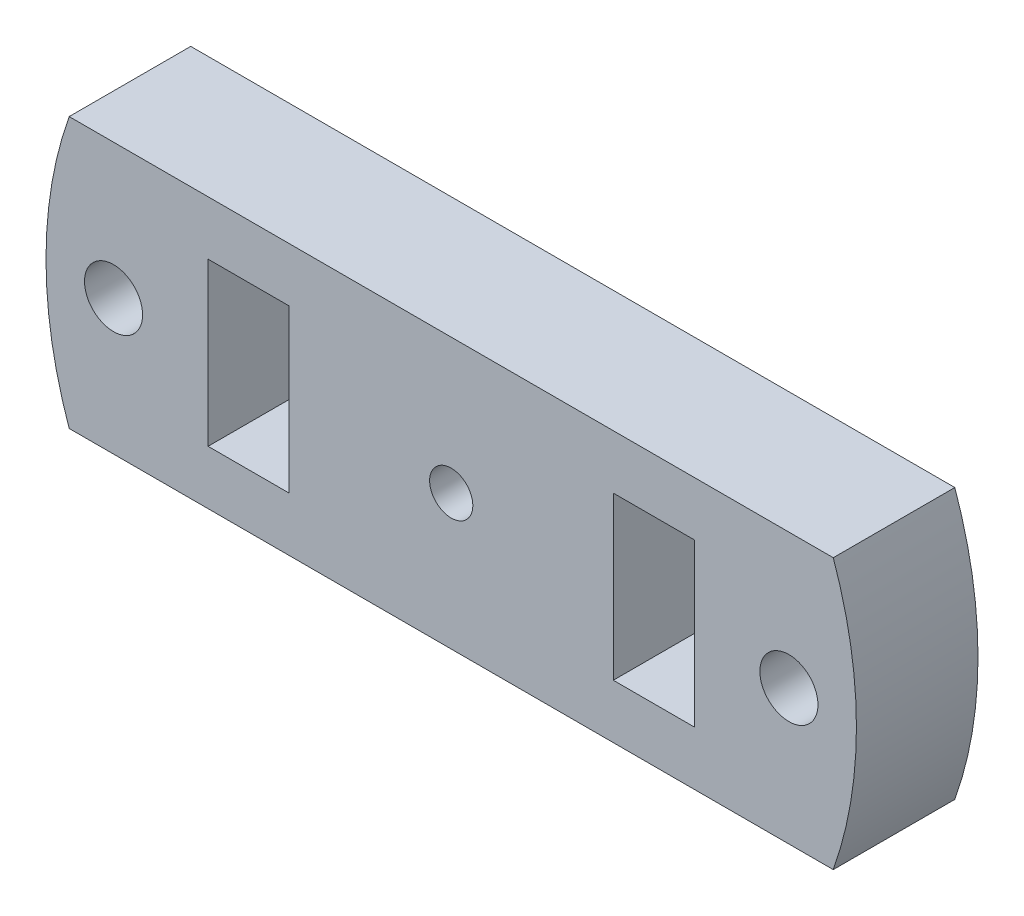
ISO-10303-21;
HEADER;
FILE_DESCRIPTION(('STEP AP214'),'2;1');
FILE_NAME('part.step','',(''),(''),'','','');
FILE_SCHEMA(('AUTOMOTIVE_DESIGN { 1 0 10303 214 1 1 1 1 }'));
ENDSEC;
DATA;
#1=APPLICATION_CONTEXT('core data for automotive mechanical design processes');
#2=APPLICATION_PROTOCOL_DEFINITION('international standard','automotive_design',2000,#1);
#3=PRODUCT_CONTEXT('',#1,'mechanical');
#4=PRODUCT('Part','Part','',(#3));
#5=PRODUCT_RELATED_PRODUCT_CATEGORY('part','',(#4));
#6=PRODUCT_DEFINITION_FORMATION('','',#4);
#7=PRODUCT_DEFINITION_CONTEXT('part definition',#1,'design');
#8=PRODUCT_DEFINITION('design','',#6,#7);
#9=PRODUCT_DEFINITION_SHAPE('','',#8);
#10=(LENGTH_UNIT() NAMED_UNIT(*) SI_UNIT(.MILLI.,.METRE.));
#11=(NAMED_UNIT(*) PLANE_ANGLE_UNIT() SI_UNIT($,.RADIAN.));
#12=(NAMED_UNIT(*) SI_UNIT($,.STERADIAN.) SOLID_ANGLE_UNIT());
#13=UNCERTAINTY_MEASURE_WITH_UNIT(LENGTH_MEASURE(1.E-05),#10,'distance_accuracy_value','');
#14=(GEOMETRIC_REPRESENTATION_CONTEXT(3) GLOBAL_UNCERTAINTY_ASSIGNED_CONTEXT((#13)) GLOBAL_UNIT_ASSIGNED_CONTEXT((#10,
#11,#12)) REPRESENTATION_CONTEXT('',''));
#15=CARTESIAN_POINT('',(0.,0.,0.));
#16=DIRECTION('',(0.,0.,1.));
#17=DIRECTION('',(1.,0.,0.));
#18=AXIS2_PLACEMENT_3D('',#15,#16,#17);
#19=CARTESIAN_POINT('',(0.,0.,9.));
#20=DIRECTION('',(0.,0.,1.));
#21=DIRECTION('',(1.,0.,0.));
#22=AXIS2_PLACEMENT_3D('',#19,#20,#21);
#23=PLANE('',#22);
#24=CARTESIAN_POINT('',(0.,0.,9.));
#25=DIRECTION('',(0.,0.,1.));
#26=DIRECTION('',(1.,0.,0.));
#27=AXIS2_PLACEMENT_3D('',#24,#25,#26);
#28=CIRCLE('',#27,1.6);
#29=CARTESIAN_POINT('',(1.6,0.,9.));
#30=VERTEX_POINT('',#29);
#31=EDGE_CURVE('E456',#30,#30,#28,.T.);
#32=ORIENTED_EDGE('',*,*,#31,.F.);
#33=EDGE_LOOP('',(#32));
#34=FACE_BOUND('',#33,.T.);
#35=CARTESIAN_POINT('',(-25.,0.,9.));
#36=DIRECTION('',(0.,0.,1.));
#37=DIRECTION('',(1.,0.,0.));
#38=AXIS2_PLACEMENT_3D('',#35,#36,#37);
#39=CIRCLE('',#38,2.15);
#40=CARTESIAN_POINT('',(-22.85,0.,9.));
#41=VERTEX_POINT('',#40);
#42=EDGE_CURVE('E151',#41,#41,#39,.T.);
#43=ORIENTED_EDGE('',*,*,#42,.F.);
#44=EDGE_LOOP('',(#43));
#45=FACE_BOUND('',#44,.T.);
#46=DIRECTION('',(1.,0.,0.));
#47=VECTOR('',#46,1.);
#48=CARTESIAN_POINT('',(-18.,-6.00000000000001,9.));
#49=LINE('',#48,#47);
#50=CARTESIAN_POINT('',(-18.,-6.00000000000001,9.));
#51=VERTEX_POINT('',#50);
#52=CARTESIAN_POINT('',(-12.,-6.00000000000001,9.));
#53=VERTEX_POINT('',#52);
#54=EDGE_CURVE('E163',#51,#53,#49,.T.);
#55=ORIENTED_EDGE('',*,*,#54,.F.);
#56=DIRECTION('',(0.,-1.,0.));
#57=VECTOR('',#56,1.);
#58=CARTESIAN_POINT('',(-18.,6.,9.));
#59=LINE('',#58,#57);
#60=CARTESIAN_POINT('',(-18.,6.,9.));
#61=VERTEX_POINT('',#60);
#62=EDGE_CURVE('E161',#61,#51,#59,.T.);
#63=ORIENTED_EDGE('',*,*,#62,.F.);
#64=DIRECTION('',(-1.,0.,0.));
#65=VECTOR('',#64,1.);
#66=CARTESIAN_POINT('',(-18.,6.,9.));
#67=LINE('',#66,#65);
#68=CARTESIAN_POINT('',(-12.,6.,9.));
#69=VERTEX_POINT('',#68);
#70=EDGE_CURVE('E169',#69,#61,#67,.T.);
#71=ORIENTED_EDGE('',*,*,#70,.F.);
#72=DIRECTION('',(0.,1.,0.));
#73=VECTOR('',#72,1.);
#74=CARTESIAN_POINT('',(-12.,6.,9.));
#75=LINE('',#74,#73);
#76=EDGE_CURVE('E166',#53,#69,#75,.T.);
#77=ORIENTED_EDGE('',*,*,#76,.F.);
#78=EDGE_LOOP('',(#55,#63,#71,#77));
#79=FACE_BOUND('',#78,.T.);
#80=DIRECTION('',(1.,0.,0.));
#81=VECTOR('',#80,1.);
#82=CARTESIAN_POINT('',(0.,-10.,9.));
#83=LINE('',#82,#81);
#84=CARTESIAN_POINT('',(-28.2842712474619,-10.,9.));
#85=VERTEX_POINT('',#84);
#86=CARTESIAN_POINT('',(28.2842712474619,-10.,9.));
#87=VERTEX_POINT('',#86);
#88=EDGE_CURVE('E192',#85,#87,#83,.T.);
#89=ORIENTED_EDGE('',*,*,#88,.T.);
#90=CARTESIAN_POINT('',(0.,0.,9.));
#91=DIRECTION('',(0.,0.,1.));
#92=DIRECTION('',(1.,0.,0.));
#93=AXIS2_PLACEMENT_3D('',#90,#91,#92);
#94=CIRCLE('',#93,30.);
#95=CARTESIAN_POINT('',(28.2842712474619,10.,9.));
#96=VERTEX_POINT('',#95);
#97=EDGE_CURVE('E195',#87,#96,#94,.T.);
#98=ORIENTED_EDGE('',*,*,#97,.T.);
#99=DIRECTION('',(-1.,0.,0.));
#100=VECTOR('',#99,1.);
#101=CARTESIAN_POINT('',(0.,10.,9.));
#102=LINE('',#101,#100);
#103=CARTESIAN_POINT('',(-28.2842712474619,10.,9.));
#104=VERTEX_POINT('',#103);
#105=EDGE_CURVE('E198',#96,#104,#102,.T.);
#106=ORIENTED_EDGE('',*,*,#105,.T.);
#107=CARTESIAN_POINT('',(0.,0.,9.));
#108=DIRECTION('',(0.,0.,1.));
#109=DIRECTION('',(1.,0.,0.));
#110=AXIS2_PLACEMENT_3D('',#107,#108,#109);
#111=CIRCLE('',#110,30.);
#112=EDGE_CURVE('E200',#104,#85,#111,.T.);
#113=ORIENTED_EDGE('',*,*,#112,.T.);
#114=EDGE_LOOP('',(#89,#98,#106,#113));
#115=FACE_BOUND('',#114,.T.);
#116=DIRECTION('',(1.,0.,0.));
#117=VECTOR('',#116,1.);
#118=CARTESIAN_POINT('',(12.,-6.,9.));
#119=LINE('',#118,#117);
#120=CARTESIAN_POINT('',(12.,-6.,9.));
#121=VERTEX_POINT('',#120);
#122=CARTESIAN_POINT('',(18.,-6.,9.));
#123=VERTEX_POINT('',#122);
#124=EDGE_CURVE('E130',#121,#123,#119,.T.);
#125=ORIENTED_EDGE('',*,*,#124,.F.);
#126=DIRECTION('',(0.,-1.,0.));
#127=VECTOR('',#126,1.);
#128=CARTESIAN_POINT('',(12.,6.,9.));
#129=LINE('',#128,#127);
#130=CARTESIAN_POINT('',(12.,6.,9.));
#131=VERTEX_POINT('',#130);
#132=EDGE_CURVE('E122',#131,#121,#129,.T.);
#133=ORIENTED_EDGE('',*,*,#132,.F.);
#134=DIRECTION('',(-1.,0.,0.));
#135=VECTOR('',#134,1.);
#136=CARTESIAN_POINT('',(12.,6.,9.));
#137=LINE('',#136,#135);
#138=CARTESIAN_POINT('',(18.,6.,9.));
#139=VERTEX_POINT('',#138);
#140=EDGE_CURVE('E145',#139,#131,#137,.T.);
#141=ORIENTED_EDGE('',*,*,#140,.F.);
#142=DIRECTION('',(0.,1.,0.));
#143=VECTOR('',#142,1.);
#144=CARTESIAN_POINT('',(18.,6.,9.));
#145=LINE('',#144,#143);
#146=EDGE_CURVE('E143',#123,#139,#145,.T.);
#147=ORIENTED_EDGE('',*,*,#146,.F.);
#148=EDGE_LOOP('',(#125,#133,#141,#147));
#149=FACE_BOUND('',#148,.T.);
#150=CARTESIAN_POINT('',(25.,0.,9.));
#151=DIRECTION('',(0.,0.,1.));
#152=DIRECTION('',(1.,0.,0.));
#153=AXIS2_PLACEMENT_3D('',#150,#151,#152);
#154=CIRCLE('',#153,2.15);
#155=CARTESIAN_POINT('',(27.15,0.,9.));
#156=VERTEX_POINT('',#155);
#157=EDGE_CURVE('E437',#156,#156,#154,.T.);
#158=ORIENTED_EDGE('',*,*,#157,.F.);
#159=EDGE_LOOP('',(#158));
#160=FACE_BOUND('',#159,.T.);
#161=ADVANCED_FACE('F32',(#34,#45,#79,#115,#149,#160),#23,.T.);
#162=CARTESIAN_POINT('',(0.,0.,0.));
#163=DIRECTION('',(0.,0.,1.));
#164=DIRECTION('',(1.,0.,0.));
#165=AXIS2_PLACEMENT_3D('',#162,#163,#164);
#166=PLANE('',#165);
#167=CARTESIAN_POINT('',(0.,0.,0.));
#168=DIRECTION('',(0.,0.,-1.));
#169=DIRECTION('',(-1.,0.,0.));
#170=AXIS2_PLACEMENT_3D('',#167,#168,#169);
#171=CIRCLE('',#170,8.);
#172=CARTESIAN_POINT('',(-8.,0.,0.));
#173=VERTEX_POINT('',#172);
#174=EDGE_CURVE('E444',#173,#173,#171,.T.);
#175=ORIENTED_EDGE('',*,*,#174,.F.);
#176=EDGE_LOOP('',(#175));
#177=FACE_BOUND('',#176,.T.);
#178=CARTESIAN_POINT('',(-25.,0.,0.));
#179=DIRECTION('',(0.,0.,1.));
#180=DIRECTION('',(1.,0.,0.));
#181=AXIS2_PLACEMENT_3D('',#178,#179,#180);
#182=CIRCLE('',#181,2.15);
#183=CARTESIAN_POINT('',(-22.85,0.,0.));
#184=VERTEX_POINT('',#183);
#185=EDGE_CURVE('E441',#184,#184,#182,.T.);
#186=ORIENTED_EDGE('',*,*,#185,.T.);
#187=EDGE_LOOP('',(#186));
#188=FACE_BOUND('',#187,.T.);
#189=DIRECTION('',(0.,-1.,0.));
#190=VECTOR('',#189,1.);
#191=CARTESIAN_POINT('',(-18.,6.,0.));
#192=LINE('',#191,#190);
#193=CARTESIAN_POINT('',(-18.,6.,0.));
#194=VERTEX_POINT('',#193);
#195=CARTESIAN_POINT('',(-18.,-6.00000000000001,0.));
#196=VERTEX_POINT('',#195);
#197=EDGE_CURVE('E138',#194,#196,#192,.T.);
#198=ORIENTED_EDGE('',*,*,#197,.T.);
#199=DIRECTION('',(1.,0.,0.));
#200=VECTOR('',#199,1.);
#201=CARTESIAN_POINT('',(-18.,-6.00000000000001,0.));
#202=LINE('',#201,#200);
#203=CARTESIAN_POINT('',(-12.,-6.00000000000001,0.));
#204=VERTEX_POINT('',#203);
#205=EDGE_CURVE('E174',#196,#204,#202,.T.);
#206=ORIENTED_EDGE('',*,*,#205,.T.);
#207=DIRECTION('',(0.,1.,0.));
#208=VECTOR('',#207,1.);
#209=CARTESIAN_POINT('',(-12.,6.,0.));
#210=LINE('',#209,#208);
#211=CARTESIAN_POINT('',(-12.,6.,0.));
#212=VERTEX_POINT('',#211);
#213=EDGE_CURVE('E177',#204,#212,#210,.T.);
#214=ORIENTED_EDGE('',*,*,#213,.T.);
#215=DIRECTION('',(-1.,0.,0.));
#216=VECTOR('',#215,1.);
#217=CARTESIAN_POINT('',(-18.,6.,0.));
#218=LINE('',#217,#216);
#219=EDGE_CURVE('E164',#212,#194,#218,.T.);
#220=ORIENTED_EDGE('',*,*,#219,.T.);
#221=EDGE_LOOP('',(#198,#206,#214,#220));
#222=FACE_BOUND('',#221,.T.);
#223=CARTESIAN_POINT('',(0.,0.,0.));
#224=DIRECTION('',(0.,0.,1.));
#225=DIRECTION('',(1.,0.,0.));
#226=AXIS2_PLACEMENT_3D('',#223,#224,#225);
#227=CIRCLE('',#226,30.);
#228=CARTESIAN_POINT('',(28.2842712474619,-10.,0.));
#229=VERTEX_POINT('',#228);
#230=CARTESIAN_POINT('',(28.2842712474619,10.,0.));
#231=VERTEX_POINT('',#230);
#232=EDGE_CURVE('E191',#229,#231,#227,.T.);
#233=ORIENTED_EDGE('',*,*,#232,.F.);
#234=DIRECTION('',(1.,0.,0.));
#235=VECTOR('',#234,1.);
#236=CARTESIAN_POINT('',(0.,-10.,0.));
#237=LINE('',#236,#235);
#238=CARTESIAN_POINT('',(-28.2842712474619,-10.,0.));
#239=VERTEX_POINT('',#238);
#240=EDGE_CURVE('E196',#239,#229,#237,.T.);
#241=ORIENTED_EDGE('',*,*,#240,.F.);
#242=CARTESIAN_POINT('',(0.,0.,0.));
#243=DIRECTION('',(0.,0.,1.));
#244=DIRECTION('',(1.,0.,0.));
#245=AXIS2_PLACEMENT_3D('',#242,#243,#244);
#246=CIRCLE('',#245,30.);
#247=CARTESIAN_POINT('',(-28.2842712474619,10.,0.));
#248=VERTEX_POINT('',#247);
#249=EDGE_CURVE('E208',#248,#239,#246,.T.);
#250=ORIENTED_EDGE('',*,*,#249,.F.);
#251=DIRECTION('',(-1.,0.,0.));
#252=VECTOR('',#251,1.);
#253=CARTESIAN_POINT('',(0.,10.,0.));
#254=LINE('',#253,#252);
#255=EDGE_CURVE('E206',#231,#248,#254,.T.);
#256=ORIENTED_EDGE('',*,*,#255,.F.);
#257=EDGE_LOOP('',(#233,#241,#250,#256));
#258=FACE_BOUND('',#257,.T.);
#259=DIRECTION('',(0.,-1.,0.));
#260=VECTOR('',#259,1.);
#261=CARTESIAN_POINT('',(12.,6.,0.));
#262=LINE('',#261,#260);
#263=CARTESIAN_POINT('',(12.,6.,0.));
#264=VERTEX_POINT('',#263);
#265=CARTESIAN_POINT('',(12.,-6.,0.));
#266=VERTEX_POINT('',#265);
#267=EDGE_CURVE('E56',#264,#266,#262,.T.);
#268=ORIENTED_EDGE('',*,*,#267,.T.);
#269=DIRECTION('',(1.,0.,0.));
#270=VECTOR('',#269,1.);
#271=CARTESIAN_POINT('',(12.,-6.,0.));
#272=LINE('',#271,#270);
#273=CARTESIAN_POINT('',(18.,-6.,0.));
#274=VERTEX_POINT('',#273);
#275=EDGE_CURVE('E137',#266,#274,#272,.T.);
#276=ORIENTED_EDGE('',*,*,#275,.T.);
#277=DIRECTION('',(0.,1.,0.));
#278=VECTOR('',#277,1.);
#279=CARTESIAN_POINT('',(18.,6.,0.));
#280=LINE('',#279,#278);
#281=CARTESIAN_POINT('',(18.,6.,0.));
#282=VERTEX_POINT('',#281);
#283=EDGE_CURVE('E153',#274,#282,#280,.T.);
#284=ORIENTED_EDGE('',*,*,#283,.T.);
#285=DIRECTION('',(-1.,0.,0.));
#286=VECTOR('',#285,1.);
#287=CARTESIAN_POINT('',(12.,6.,0.));
#288=LINE('',#287,#286);
#289=EDGE_CURVE('E131',#282,#264,#288,.T.);
#290=ORIENTED_EDGE('',*,*,#289,.T.);
#291=EDGE_LOOP('',(#268,#276,#284,#290));
#292=FACE_BOUND('',#291,.T.);
#293=CARTESIAN_POINT('',(25.,0.,0.));
#294=DIRECTION('',(0.,0.,1.));
#295=DIRECTION('',(1.,0.,0.));
#296=AXIS2_PLACEMENT_3D('',#293,#294,#295);
#297=CIRCLE('',#296,2.15);
#298=CARTESIAN_POINT('',(27.15,0.,0.));
#299=VERTEX_POINT('',#298);
#300=EDGE_CURVE('E435',#299,#299,#297,.T.);
#301=ORIENTED_EDGE('',*,*,#300,.T.);
#302=EDGE_LOOP('',(#301));
#303=FACE_BOUND('',#302,.T.);
#304=ADVANCED_FACE('F227',(#177,#188,#222,#258,#292,#303),#166,.F.);
#305=CARTESIAN_POINT('',(0.,0.,9.));
#306=DIRECTION('',(0.,0.,-1.));
#307=DIRECTION('',(-1.,0.,0.));
#308=AXIS2_PLACEMENT_3D('',#305,#306,#307);
#309=CYLINDRICAL_SURFACE('',#308,30.);
#310=ORIENTED_EDGE('',*,*,#232,.T.);
#311=DIRECTION('',(0.,0.,-1.));
#312=VECTOR('',#311,1.);
#313=CARTESIAN_POINT('',(28.2842712474619,10.,9.));
#314=LINE('',#313,#312);
#315=EDGE_CURVE('E41',#96,#231,#314,.T.);
#316=ORIENTED_EDGE('',*,*,#315,.F.);
#317=ORIENTED_EDGE('',*,*,#97,.F.);
#318=DIRECTION('',(0.,0.,-1.));
#319=VECTOR('',#318,1.);
#320=CARTESIAN_POINT('',(28.2842712474619,-10.,9.));
#321=LINE('',#320,#319);
#322=EDGE_CURVE('E11',#87,#229,#321,.T.);
#323=ORIENTED_EDGE('',*,*,#322,.T.);
#324=EDGE_LOOP('',(#310,#316,#317,#323));
#325=FACE_BOUND('',#324,.T.);
#326=ADVANCED_FACE('F34',(#325),#309,.T.);
#327=CARTESIAN_POINT('',(0.,10.,9.));
#328=DIRECTION('',(0.,-1.,0.));
#329=DIRECTION('',(0.,0.,-1.));
#330=AXIS2_PLACEMENT_3D('',#327,#328,#329);
#331=PLANE('',#330);
#332=ORIENTED_EDGE('',*,*,#255,.T.);
#333=DIRECTION('',(0.,0.,-1.));
#334=VECTOR('',#333,1.);
#335=CARTESIAN_POINT('',(-28.2842712474619,10.,9.));
#336=LINE('',#335,#334);
#337=EDGE_CURVE('E213',#104,#248,#336,.T.);
#338=ORIENTED_EDGE('',*,*,#337,.F.);
#339=ORIENTED_EDGE('',*,*,#105,.F.);
#340=ORIENTED_EDGE('',*,*,#315,.T.);
#341=EDGE_LOOP('',(#332,#338,#339,#340));
#342=FACE_BOUND('',#341,.T.);
#343=ADVANCED_FACE('F220',(#342),#331,.F.);
#344=CARTESIAN_POINT('',(0.,0.,9.));
#345=DIRECTION('',(0.,0.,-1.));
#346=DIRECTION('',(-1.,0.,0.));
#347=AXIS2_PLACEMENT_3D('',#344,#345,#346);
#348=CYLINDRICAL_SURFACE('',#347,30.);
#349=ORIENTED_EDGE('',*,*,#249,.T.);
#350=DIRECTION('',(0.,0.,-1.));
#351=VECTOR('',#350,1.);
#352=CARTESIAN_POINT('',(-28.2842712474619,-10.,9.));
#353=LINE('',#352,#351);
#354=EDGE_CURVE('E203',#85,#239,#353,.T.);
#355=ORIENTED_EDGE('',*,*,#354,.F.);
#356=ORIENTED_EDGE('',*,*,#112,.F.);
#357=ORIENTED_EDGE('',*,*,#337,.T.);
#358=EDGE_LOOP('',(#349,#355,#356,#357));
#359=FACE_BOUND('',#358,.T.);
#360=ADVANCED_FACE('F232',(#359),#348,.T.);
#361=CARTESIAN_POINT('',(0.,-10.,9.));
#362=DIRECTION('',(0.,1.,0.));
#363=DIRECTION('',(0.,0.,1.));
#364=AXIS2_PLACEMENT_3D('',#361,#362,#363);
#365=PLANE('',#364);
#366=ORIENTED_EDGE('',*,*,#240,.T.);
#367=ORIENTED_EDGE('',*,*,#322,.F.);
#368=ORIENTED_EDGE('',*,*,#88,.F.);
#369=ORIENTED_EDGE('',*,*,#354,.T.);
#370=EDGE_LOOP('',(#366,#367,#368,#369));
#371=FACE_BOUND('',#370,.T.);
#372=ADVANCED_FACE('F235',(#371),#365,.F.);
#373=CARTESIAN_POINT('',(-18.,6.,9.));
#374=DIRECTION('',(1.,0.,0.));
#375=DIRECTION('',(0.,1.,0.));
#376=AXIS2_PLACEMENT_3D('',#373,#374,#375);
#377=PLANE('',#376);
#378=ORIENTED_EDGE('',*,*,#197,.F.);
#379=DIRECTION('',(0.,0.,-1.));
#380=VECTOR('',#379,1.);
#381=CARTESIAN_POINT('',(-18.,6.,9.));
#382=LINE('',#381,#380);
#383=EDGE_CURVE('E171',#61,#194,#382,.T.);
#384=ORIENTED_EDGE('',*,*,#383,.F.);
#385=ORIENTED_EDGE('',*,*,#62,.T.);
#386=DIRECTION('',(0.,0.,-1.));
#387=VECTOR('',#386,1.);
#388=CARTESIAN_POINT('',(-18.,-6.00000000000001,9.));
#389=LINE('',#388,#387);
#390=EDGE_CURVE('E188',#51,#196,#389,.T.);
#391=ORIENTED_EDGE('',*,*,#390,.T.);
#392=EDGE_LOOP('',(#378,#384,#385,#391));
#393=FACE_BOUND('',#392,.T.);
#394=ADVANCED_FACE('F248',(#393),#377,.T.);
#395=CARTESIAN_POINT('',(-18.,-6.00000000000001,9.));
#396=DIRECTION('',(0.,1.,0.));
#397=DIRECTION('',(0.,0.,1.));
#398=AXIS2_PLACEMENT_3D('',#395,#396,#397);
#399=PLANE('',#398);
#400=ORIENTED_EDGE('',*,*,#205,.F.);
#401=ORIENTED_EDGE('',*,*,#390,.F.);
#402=ORIENTED_EDGE('',*,*,#54,.T.);
#403=DIRECTION('',(0.,0.,-1.));
#404=VECTOR('',#403,1.);
#405=CARTESIAN_POINT('',(-12.,-6.00000000000001,9.));
#406=LINE('',#405,#404);
#407=EDGE_CURVE('E186',#53,#204,#406,.T.);
#408=ORIENTED_EDGE('',*,*,#407,.T.);
#409=EDGE_LOOP('',(#400,#401,#402,#408));
#410=FACE_BOUND('',#409,.T.);
#411=ADVANCED_FACE('F334',(#410),#399,.T.);
#412=CARTESIAN_POINT('',(-12.,6.,9.));
#413=DIRECTION('',(-1.,0.,0.));
#414=DIRECTION('',(0.,-1.,0.));
#415=AXIS2_PLACEMENT_3D('',#412,#413,#414);
#416=PLANE('',#415);
#417=ORIENTED_EDGE('',*,*,#213,.F.);
#418=ORIENTED_EDGE('',*,*,#407,.F.);
#419=ORIENTED_EDGE('',*,*,#76,.T.);
#420=DIRECTION('',(0.,0.,-1.));
#421=VECTOR('',#420,1.);
#422=CARTESIAN_POINT('',(-12.,6.,9.));
#423=LINE('',#422,#421);
#424=EDGE_CURVE('E184',#69,#212,#423,.T.);
#425=ORIENTED_EDGE('',*,*,#424,.T.);
#426=EDGE_LOOP('',(#417,#418,#419,#425));
#427=FACE_BOUND('',#426,.T.);
#428=ADVANCED_FACE('F331',(#427),#416,.T.);
#429=CARTESIAN_POINT('',(-18.,6.,9.));
#430=DIRECTION('',(0.,-1.,0.));
#431=DIRECTION('',(0.,0.,-1.));
#432=AXIS2_PLACEMENT_3D('',#429,#430,#431);
#433=PLANE('',#432);
#434=ORIENTED_EDGE('',*,*,#219,.F.);
#435=ORIENTED_EDGE('',*,*,#424,.F.);
#436=ORIENTED_EDGE('',*,*,#70,.T.);
#437=ORIENTED_EDGE('',*,*,#383,.T.);
#438=EDGE_LOOP('',(#434,#435,#436,#437));
#439=FACE_BOUND('',#438,.T.);
#440=ADVANCED_FACE('F328',(#439),#433,.T.);
#441=CARTESIAN_POINT('',(12.,6.,9.));
#442=DIRECTION('',(1.,0.,0.));
#443=DIRECTION('',(0.,1.,0.));
#444=AXIS2_PLACEMENT_3D('',#441,#442,#443);
#445=PLANE('',#444);
#446=ORIENTED_EDGE('',*,*,#267,.F.);
#447=DIRECTION('',(0.,0.,-1.));
#448=VECTOR('',#447,1.);
#449=CARTESIAN_POINT('',(12.,6.,9.));
#450=LINE('',#449,#448);
#451=EDGE_CURVE('E126',#131,#264,#450,.T.);
#452=ORIENTED_EDGE('',*,*,#451,.F.);
#453=ORIENTED_EDGE('',*,*,#132,.T.);
#454=DIRECTION('',(0.,0.,-1.));
#455=VECTOR('',#454,1.);
#456=CARTESIAN_POINT('',(12.,-6.,9.));
#457=LINE('',#456,#455);
#458=EDGE_CURVE('E125',#121,#266,#457,.T.);
#459=ORIENTED_EDGE('',*,*,#458,.T.);
#460=EDGE_LOOP('',(#446,#452,#453,#459));
#461=FACE_BOUND('',#460,.T.);
#462=ADVANCED_FACE('F124',(#461),#445,.T.);
#463=CARTESIAN_POINT('',(12.,-6.,9.));
#464=DIRECTION('',(0.,1.,0.));
#465=DIRECTION('',(0.,0.,1.));
#466=AXIS2_PLACEMENT_3D('',#463,#464,#465);
#467=PLANE('',#466);
#468=ORIENTED_EDGE('',*,*,#275,.F.);
#469=ORIENTED_EDGE('',*,*,#458,.F.);
#470=ORIENTED_EDGE('',*,*,#124,.T.);
#471=DIRECTION('',(0.,0.,-1.));
#472=VECTOR('',#471,1.);
#473=CARTESIAN_POINT('',(18.,-6.,9.));
#474=LINE('',#473,#472);
#475=EDGE_CURVE('E139',#123,#274,#474,.T.);
#476=ORIENTED_EDGE('',*,*,#475,.T.);
#477=EDGE_LOOP('',(#468,#469,#470,#476));
#478=FACE_BOUND('',#477,.T.);
#479=ADVANCED_FACE('F134',(#478),#467,.T.);
#480=CARTESIAN_POINT('',(18.,6.,9.));
#481=DIRECTION('',(-1.,0.,0.));
#482=DIRECTION('',(0.,0.,1.));
#483=AXIS2_PLACEMENT_3D('',#480,#481,#482);
#484=PLANE('',#483);
#485=ORIENTED_EDGE('',*,*,#283,.F.);
#486=ORIENTED_EDGE('',*,*,#475,.F.);
#487=ORIENTED_EDGE('',*,*,#146,.T.);
#488=DIRECTION('',(0.,0.,-1.));
#489=VECTOR('',#488,1.);
#490=CARTESIAN_POINT('',(18.,6.,9.));
#491=LINE('',#490,#489);
#492=EDGE_CURVE('E48',#139,#282,#491,.T.);
#493=ORIENTED_EDGE('',*,*,#492,.T.);
#494=EDGE_LOOP('',(#485,#486,#487,#493));
#495=FACE_BOUND('',#494,.T.);
#496=ADVANCED_FACE('F320',(#495),#484,.T.);
#497=CARTESIAN_POINT('',(12.,6.,9.));
#498=DIRECTION('',(0.,-1.,0.));
#499=DIRECTION('',(0.,0.,-1.));
#500=AXIS2_PLACEMENT_3D('',#497,#498,#499);
#501=PLANE('',#500);
#502=ORIENTED_EDGE('',*,*,#289,.F.);
#503=ORIENTED_EDGE('',*,*,#492,.F.);
#504=ORIENTED_EDGE('',*,*,#140,.T.);
#505=ORIENTED_EDGE('',*,*,#451,.T.);
#506=EDGE_LOOP('',(#502,#503,#504,#505));
#507=FACE_BOUND('',#506,.T.);
#508=ADVANCED_FACE('F316',(#507),#501,.T.);
#509=CARTESIAN_POINT('',(-25.,0.,9.));
#510=DIRECTION('',(0.,0.,-1.));
#511=DIRECTION('',(-1.,0.,0.));
#512=AXIS2_PLACEMENT_3D('',#509,#510,#511);
#513=CYLINDRICAL_SURFACE('',#512,2.15);
#514=ORIENTED_EDGE('',*,*,#42,.T.);
#515=EDGE_LOOP('',(#514));
#516=FACE_BOUND('',#515,.T.);
#517=ORIENTED_EDGE('',*,*,#185,.F.);
#518=EDGE_LOOP('',(#517));
#519=FACE_BOUND('',#518,.T.);
#520=ADVANCED_FACE('F312',(#516,#519),#513,.F.);
#521=CARTESIAN_POINT('',(25.,0.,9.));
#522=DIRECTION('',(0.,0.,-1.));
#523=DIRECTION('',(-1.,0.,0.));
#524=AXIS2_PLACEMENT_3D('',#521,#522,#523);
#525=CYLINDRICAL_SURFACE('',#524,2.15);
#526=ORIENTED_EDGE('',*,*,#157,.T.);
#527=EDGE_LOOP('',(#526));
#528=FACE_BOUND('',#527,.T.);
#529=ORIENTED_EDGE('',*,*,#300,.F.);
#530=EDGE_LOOP('',(#529));
#531=FACE_BOUND('',#530,.T.);
#532=ADVANCED_FACE('F271',(#528,#531),#525,.F.);
#533=CARTESIAN_POINT('',(0.,0.,5.));
#534=DIRECTION('',(0.,0.,-1.));
#535=DIRECTION('',(-1.,0.,0.));
#536=AXIS2_PLACEMENT_3D('',#533,#534,#535);
#537=CYLINDRICAL_SURFACE('',#536,8.);
#538=CARTESIAN_POINT('',(0.,0.,5.));
#539=DIRECTION('',(0.,0.,-1.));
#540=DIRECTION('',(-1.,0.,0.));
#541=AXIS2_PLACEMENT_3D('',#538,#539,#540);
#542=CIRCLE('',#541,8.);
#543=CARTESIAN_POINT('',(-8.,0.,5.));
#544=VERTEX_POINT('',#543);
#545=EDGE_CURVE('E438',#544,#544,#542,.T.);
#546=ORIENTED_EDGE('',*,*,#545,.F.);
#547=EDGE_LOOP('',(#546));
#548=FACE_BOUND('',#547,.T.);
#549=ORIENTED_EDGE('',*,*,#174,.T.);
#550=EDGE_LOOP('',(#549));
#551=FACE_BOUND('',#550,.T.);
#552=ADVANCED_FACE('F276',(#548,#551),#537,.F.);
#553=CARTESIAN_POINT('',(0.,0.,5.));
#554=DIRECTION('',(0.,0.,-1.));
#555=DIRECTION('',(-1.,0.,0.));
#556=AXIS2_PLACEMENT_3D('',#553,#554,#555);
#557=PLANE('',#556);
#558=CARTESIAN_POINT('',(0.,0.,5.));
#559=DIRECTION('',(0.,0.,-1.));
#560=DIRECTION('',(-1.,0.,0.));
#561=AXIS2_PLACEMENT_3D('',#558,#559,#560);
#562=CIRCLE('',#561,1.6);
#563=CARTESIAN_POINT('',(-1.6,0.,5.));
#564=VERTEX_POINT('',#563);
#565=EDGE_CURVE('E36',#564,#564,#562,.T.);
#566=ORIENTED_EDGE('',*,*,#565,.F.);
#567=EDGE_LOOP('',(#566));
#568=FACE_BOUND('',#567,.T.);
#569=ORIENTED_EDGE('',*,*,#545,.T.);
#570=EDGE_LOOP('',(#569));
#571=FACE_BOUND('',#570,.T.);
#572=ADVANCED_FACE('F280',(#568,#571),#557,.T.);
#573=CARTESIAN_POINT('',(0.,0.,0.));
#574=DIRECTION('',(0.,0.,1.));
#575=DIRECTION('',(1.,0.,0.));
#576=AXIS2_PLACEMENT_3D('',#573,#574,#575);
#577=CYLINDRICAL_SURFACE('',#576,1.6);
#578=ORIENTED_EDGE('',*,*,#565,.T.);
#579=EDGE_LOOP('',(#578));
#580=FACE_BOUND('',#579,.T.);
#581=ORIENTED_EDGE('',*,*,#31,.T.);
#582=EDGE_LOOP('',(#581));
#583=FACE_BOUND('',#582,.T.);
#584=ADVANCED_FACE('F294',(#580,#583),#577,.F.);
#585=CLOSED_SHELL('',(#161,#304,#326,#343,#360,#372,#394,#411,#428,#440,#462,#479,#496,#508,
#520,#532,#552,#572,#584));
#586=MANIFOLD_SOLID_BREP('B2',#585);
#587=ADVANCED_BREP_SHAPE_REPRESENTATION('',(#18,#586),#14);
#588=SHAPE_DEFINITION_REPRESENTATION(#9,#587);
ENDSEC;
END-ISO-10303-21;
